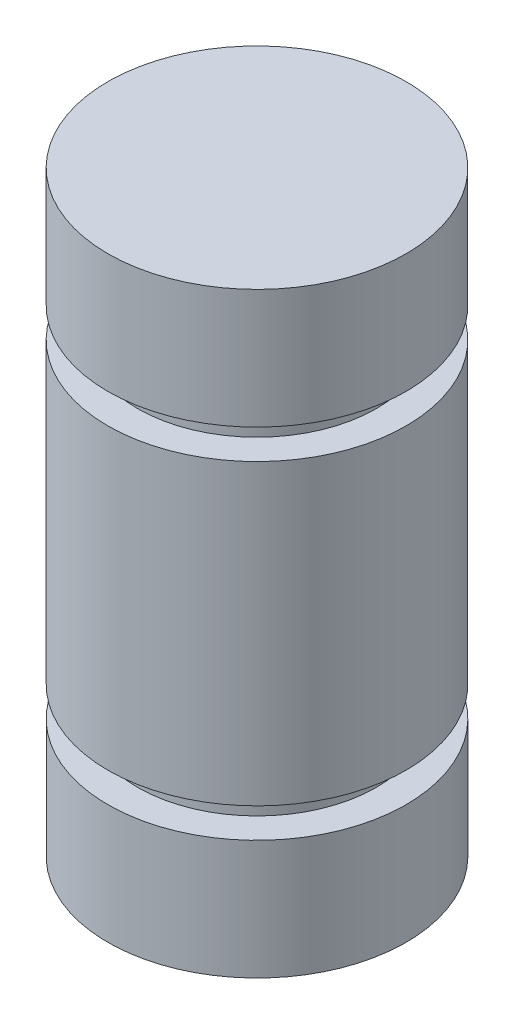
ISO-10303-21;
HEADER;
FILE_DESCRIPTION(('STEP AP214'),'2;1');
FILE_NAME('part.step','',(''),(''),'','','');
FILE_SCHEMA(('AUTOMOTIVE_DESIGN { 1 0 10303 214 1 1 1 1 }'));
ENDSEC;
DATA;
#1=APPLICATION_CONTEXT('core data for automotive mechanical design processes');
#2=APPLICATION_PROTOCOL_DEFINITION('international standard','automotive_design',2000,#1);
#3=PRODUCT_CONTEXT('',#1,'mechanical');
#4=PRODUCT('Part','Part','',(#3));
#5=PRODUCT_RELATED_PRODUCT_CATEGORY('part','',(#4));
#6=PRODUCT_DEFINITION_FORMATION('','',#4);
#7=PRODUCT_DEFINITION_CONTEXT('part definition',#1,'design');
#8=PRODUCT_DEFINITION('design','',#6,#7);
#9=PRODUCT_DEFINITION_SHAPE('','',#8);
#10=(LENGTH_UNIT() NAMED_UNIT(*) SI_UNIT(.MILLI.,.METRE.));
#11=(NAMED_UNIT(*) PLANE_ANGLE_UNIT() SI_UNIT($,.RADIAN.));
#12=(NAMED_UNIT(*) SI_UNIT($,.STERADIAN.) SOLID_ANGLE_UNIT());
#13=UNCERTAINTY_MEASURE_WITH_UNIT(LENGTH_MEASURE(1.E-05),#10,'distance_accuracy_value','');
#14=(GEOMETRIC_REPRESENTATION_CONTEXT(3) GLOBAL_UNCERTAINTY_ASSIGNED_CONTEXT((#13)) GLOBAL_UNIT_ASSIGNED_CONTEXT((#10,
#11,#12)) REPRESENTATION_CONTEXT('',''));
#15=CARTESIAN_POINT('',(0.,0.,0.));
#16=DIRECTION('',(0.,0.,1.));
#17=DIRECTION('',(1.,0.,0.));
#18=AXIS2_PLACEMENT_3D('',#15,#16,#17);
#19=CARTESIAN_POINT('',(0.,0.,0.));
#20=DIRECTION('',(0.,1.,0.));
#21=DIRECTION('',(0.,0.,1.));
#22=AXIS2_PLACEMENT_3D('',#19,#20,#21);
#23=PLANE('',#22);
#24=CARTESIAN_POINT('',(0.,0.,0.));
#25=DIRECTION('',(0.,1.,0.));
#26=DIRECTION('',(0.,0.,1.));
#27=AXIS2_PLACEMENT_3D('',#24,#25,#26);
#28=CIRCLE('',#27,6.35);
#29=CARTESIAN_POINT('',(0.,0.,6.35));
#30=VERTEX_POINT('',#29);
#31=EDGE_CURVE('E44',#30,#30,#28,.T.);
#32=ORIENTED_EDGE('',*,*,#31,.F.);
#33=EDGE_LOOP('',(#32));
#34=FACE_BOUND('',#33,.T.);
#35=CARTESIAN_POINT('',(0.,0.,0.));
#36=DIRECTION('',(0.,1.,0.));
#37=DIRECTION('',(0.,0.,1.));
#38=AXIS2_PLACEMENT_3D('',#35,#36,#37);
#39=CIRCLE('',#38,5.08);
#40=CARTESIAN_POINT('',(0.,0.,5.08));
#41=VERTEX_POINT('',#40);
#42=EDGE_CURVE('E10',#41,#41,#39,.F.);
#43=ORIENTED_EDGE('',*,*,#42,.F.);
#44=EDGE_LOOP('',(#43));
#45=FACE_BOUND('',#44,.T.);
#46=ADVANCED_FACE('F33',(#34,#45),#23,.F.);
#47=CARTESIAN_POINT('',(0.,12.7,0.));
#48=DIRECTION('',(0.,1.,0.));
#49=DIRECTION('',(0.,0.,1.));
#50=AXIS2_PLACEMENT_3D('',#47,#48,#49);
#51=PLANE('',#50);
#52=CARTESIAN_POINT('',(0.,12.7,0.));
#53=DIRECTION('',(0.,1.,0.));
#54=DIRECTION('',(0.,0.,1.));
#55=AXIS2_PLACEMENT_3D('',#52,#53,#54);
#56=CIRCLE('',#55,6.35);
#57=CARTESIAN_POINT('',(0.,12.7,6.35));
#58=VERTEX_POINT('',#57);
#59=EDGE_CURVE('E40',#58,#58,#56,.T.);
#60=ORIENTED_EDGE('',*,*,#59,.T.);
#61=EDGE_LOOP('',(#60));
#62=FACE_BOUND('',#61,.T.);
#63=CARTESIAN_POINT('',(0.,12.7,0.));
#64=DIRECTION('',(0.,1.,0.));
#65=DIRECTION('',(0.,0.,1.));
#66=AXIS2_PLACEMENT_3D('',#63,#64,#65);
#67=CIRCLE('',#66,5.08);
#68=CARTESIAN_POINT('',(0.,12.7,5.08));
#69=VERTEX_POINT('',#68);
#70=EDGE_CURVE('E51',#69,#69,#67,.T.);
#71=ORIENTED_EDGE('',*,*,#70,.F.);
#72=EDGE_LOOP('',(#71));
#73=FACE_BOUND('',#72,.T.);
#74=ADVANCED_FACE('F97',(#62,#73),#51,.T.);
#75=CARTESIAN_POINT('',(0.,12.7,0.));
#76=DIRECTION('',(0.,-1.,0.));
#77=DIRECTION('',(0.,0.,-1.));
#78=AXIS2_PLACEMENT_3D('',#75,#76,#77);
#79=CYLINDRICAL_SURFACE('',#78,6.35);
#80=ORIENTED_EDGE('',*,*,#59,.F.);
#81=EDGE_LOOP('',(#80));
#82=FACE_BOUND('',#81,.T.);
#83=ORIENTED_EDGE('',*,*,#31,.T.);
#84=EDGE_LOOP('',(#83));
#85=FACE_BOUND('',#84,.T.);
#86=ADVANCED_FACE('F35',(#82,#85),#79,.T.);
#87=CARTESIAN_POINT('',(0.,13.97,0.));
#88=DIRECTION('',(0.,-1.,0.));
#89=DIRECTION('',(0.,0.,-1.));
#90=AXIS2_PLACEMENT_3D('',#87,#88,#89);
#91=CYLINDRICAL_SURFACE('',#90,5.08);
#92=CARTESIAN_POINT('',(0.,13.97,0.));
#93=DIRECTION('',(0.,1.,0.));
#94=DIRECTION('',(0.,0.,1.));
#95=AXIS2_PLACEMENT_3D('',#92,#93,#94);
#96=CIRCLE('',#95,5.08);
#97=CARTESIAN_POINT('',(0.,13.97,5.08));
#98=VERTEX_POINT('',#97);
#99=EDGE_CURVE('E49',#98,#98,#96,.T.);
#100=ORIENTED_EDGE('',*,*,#99,.F.);
#101=EDGE_LOOP('',(#100));
#102=FACE_BOUND('',#101,.T.);
#103=ORIENTED_EDGE('',*,*,#70,.T.);
#104=EDGE_LOOP('',(#103));
#105=FACE_BOUND('',#104,.T.);
#106=ADVANCED_FACE('F106',(#102,#105),#91,.T.);
#107=CARTESIAN_POINT('',(0.,13.97,0.));
#108=DIRECTION('',(0.,1.,0.));
#109=DIRECTION('',(0.,0.,1.));
#110=AXIS2_PLACEMENT_3D('',#107,#108,#109);
#111=PLANE('',#110);
#112=CARTESIAN_POINT('',(0.,13.97,0.));
#113=DIRECTION('',(0.,1.,0.));
#114=DIRECTION('',(0.,0.,1.));
#115=AXIS2_PLACEMENT_3D('',#112,#113,#114);
#116=CIRCLE('',#115,6.35);
#117=CARTESIAN_POINT('',(0.,13.97,6.35));
#118=VERTEX_POINT('',#117);
#119=EDGE_CURVE('E57',#118,#118,#116,.T.);
#120=ORIENTED_EDGE('',*,*,#119,.F.);
#121=EDGE_LOOP('',(#120));
#122=FACE_BOUND('',#121,.T.);
#123=ORIENTED_EDGE('',*,*,#99,.T.);
#124=EDGE_LOOP('',(#123));
#125=FACE_BOUND('',#124,.T.);
#126=ADVANCED_FACE('F109',(#122,#125),#111,.F.);
#127=CARTESIAN_POINT('',(0.,19.05,0.));
#128=DIRECTION('',(0.,-1.,0.));
#129=DIRECTION('',(0.,0.,-1.));
#130=AXIS2_PLACEMENT_3D('',#127,#128,#129);
#131=CYLINDRICAL_SURFACE('',#130,6.35);
#132=CARTESIAN_POINT('',(0.,19.05,0.));
#133=DIRECTION('',(0.,1.,0.));
#134=DIRECTION('',(0.,0.,1.));
#135=AXIS2_PLACEMENT_3D('',#132,#133,#134);
#136=CIRCLE('',#135,6.35);
#137=CARTESIAN_POINT('',(0.,19.05,6.35));
#138=VERTEX_POINT('',#137);
#139=EDGE_CURVE('E54',#138,#138,#136,.T.);
#140=ORIENTED_EDGE('',*,*,#139,.F.);
#141=EDGE_LOOP('',(#140));
#142=FACE_BOUND('',#141,.T.);
#143=ORIENTED_EDGE('',*,*,#119,.T.);
#144=EDGE_LOOP('',(#143));
#145=FACE_BOUND('',#144,.T.);
#146=ADVANCED_FACE('F93',(#142,#145),#131,.T.);
#147=CARTESIAN_POINT('',(0.,19.05,0.));
#148=DIRECTION('',(0.,1.,0.));
#149=DIRECTION('',(0.,0.,1.));
#150=AXIS2_PLACEMENT_3D('',#147,#148,#149);
#151=PLANE('',#150);
#152=ORIENTED_EDGE('',*,*,#139,.T.);
#153=EDGE_LOOP('',(#152));
#154=FACE_BOUND('',#153,.T.);
#155=ADVANCED_FACE('F88',(#154),#151,.T.);
#156=CARTESIAN_POINT('',(0.,-1.27,0.));
#157=DIRECTION('',(0.,1.,0.));
#158=DIRECTION('',(0.,0.,1.));
#159=AXIS2_PLACEMENT_3D('',#156,#157,#158);
#160=CYLINDRICAL_SURFACE('',#159,5.08);
#161=CARTESIAN_POINT('',(0.,-1.27,0.));
#162=DIRECTION('',(0.,-1.,0.));
#163=DIRECTION('',(0.,0.,-1.));
#164=AXIS2_PLACEMENT_3D('',#161,#162,#163);
#165=CIRCLE('',#164,5.08);
#166=CARTESIAN_POINT('',(0.,-1.27,-5.08));
#167=VERTEX_POINT('',#166);
#168=EDGE_CURVE('E60',#167,#167,#165,.T.);
#169=ORIENTED_EDGE('',*,*,#168,.F.);
#170=EDGE_LOOP('',(#169));
#171=FACE_BOUND('',#170,.T.);
#172=ORIENTED_EDGE('',*,*,#42,.T.);
#173=EDGE_LOOP('',(#172));
#174=FACE_BOUND('',#173,.T.);
#175=ADVANCED_FACE('F83',(#171,#174),#160,.T.);
#176=CARTESIAN_POINT('',(0.,-1.27,0.));
#177=DIRECTION('',(0.,-1.,0.));
#178=DIRECTION('',(0.,0.,-1.));
#179=AXIS2_PLACEMENT_3D('',#176,#177,#178);
#180=PLANE('',#179);
#181=CARTESIAN_POINT('',(0.,-1.27,0.));
#182=DIRECTION('',(0.,-1.,0.));
#183=DIRECTION('',(0.,0.,-1.));
#184=AXIS2_PLACEMENT_3D('',#181,#182,#183);
#185=CIRCLE('',#184,6.35);
#186=CARTESIAN_POINT('',(0.,-1.27,-6.35));
#187=VERTEX_POINT('',#186);
#188=EDGE_CURVE('E66',#187,#187,#185,.T.);
#189=ORIENTED_EDGE('',*,*,#188,.F.);
#190=EDGE_LOOP('',(#189));
#191=FACE_BOUND('',#190,.T.);
#192=ORIENTED_EDGE('',*,*,#168,.T.);
#193=EDGE_LOOP('',(#192));
#194=FACE_BOUND('',#193,.T.);
#195=ADVANCED_FACE('F77',(#191,#194),#180,.F.);
#196=CARTESIAN_POINT('',(0.,-6.35,0.));
#197=DIRECTION('',(0.,1.,0.));
#198=DIRECTION('',(0.,0.,1.));
#199=AXIS2_PLACEMENT_3D('',#196,#197,#198);
#200=CYLINDRICAL_SURFACE('',#199,6.35);
#201=CARTESIAN_POINT('',(0.,-6.35,0.));
#202=DIRECTION('',(0.,-1.,0.));
#203=DIRECTION('',(0.,0.,-1.));
#204=AXIS2_PLACEMENT_3D('',#201,#202,#203);
#205=CIRCLE('',#204,6.35);
#206=CARTESIAN_POINT('',(0.,-6.35,-6.35));
#207=VERTEX_POINT('',#206);
#208=EDGE_CURVE('E65',#207,#207,#205,.T.);
#209=ORIENTED_EDGE('',*,*,#208,.F.);
#210=EDGE_LOOP('',(#209));
#211=FACE_BOUND('',#210,.T.);
#212=ORIENTED_EDGE('',*,*,#188,.T.);
#213=EDGE_LOOP('',(#212));
#214=FACE_BOUND('',#213,.T.);
#215=ADVANCED_FACE('F74',(#211,#214),#200,.T.);
#216=CARTESIAN_POINT('',(0.,-6.35,0.));
#217=DIRECTION('',(0.,-1.,0.));
#218=DIRECTION('',(0.,0.,-1.));
#219=AXIS2_PLACEMENT_3D('',#216,#217,#218);
#220=PLANE('',#219);
#221=ORIENTED_EDGE('',*,*,#208,.T.);
#222=EDGE_LOOP('',(#221));
#223=FACE_BOUND('',#222,.T.);
#224=ADVANCED_FACE('F72',(#223),#220,.T.);
#225=CLOSED_SHELL('',(#46,#74,#86,#106,#126,#146,#155,#175,#195,#215,#224));
#226=MANIFOLD_SOLID_BREP('B2',#225);
#227=ADVANCED_BREP_SHAPE_REPRESENTATION('',(#18,#226),#14);
#228=SHAPE_DEFINITION_REPRESENTATION(#9,#227);
ENDSEC;
END-ISO-10303-21;
